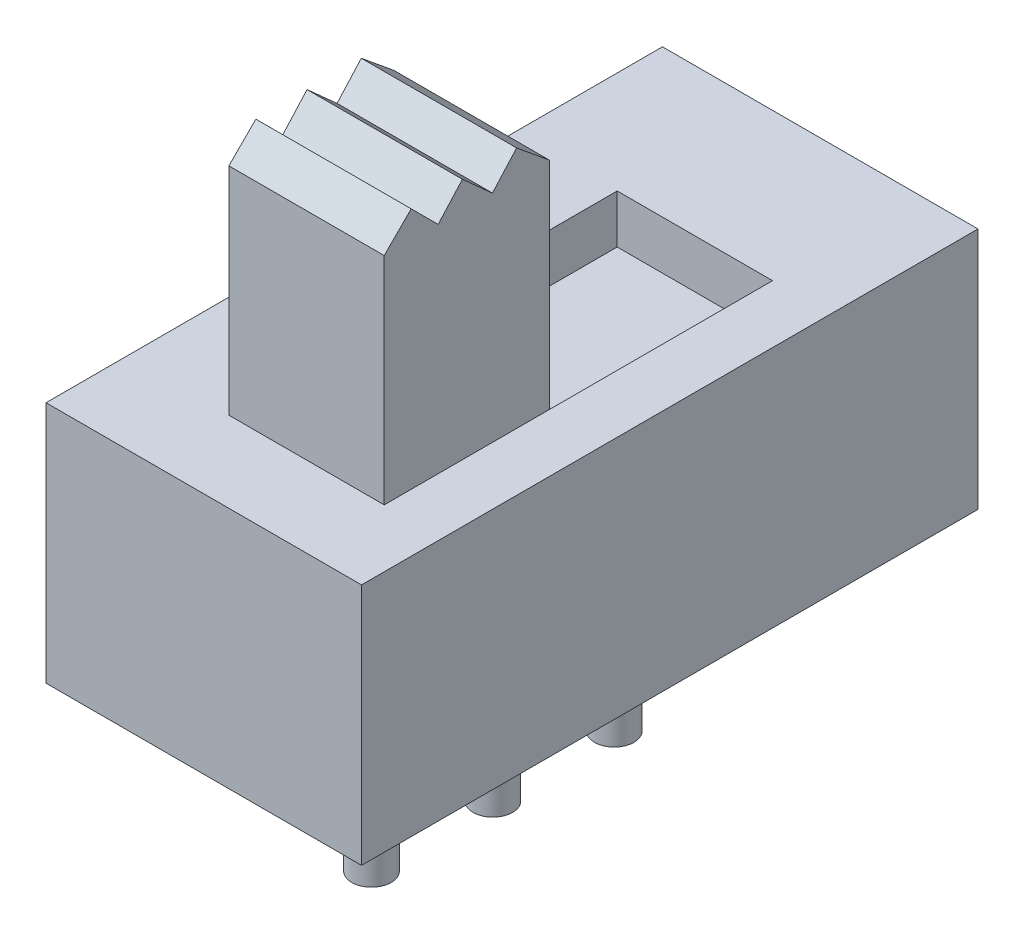
ISO-10303-21;
HEADER;
FILE_DESCRIPTION(('STEP AP214'),'2;1');
FILE_NAME('part.step','',(''),(''),'','','');
FILE_SCHEMA(('AUTOMOTIVE_DESIGN { 1 0 10303 214 1 1 1 1 }'));
ENDSEC;
DATA;
#1=APPLICATION_CONTEXT('core data for automotive mechanical design processes');
#2=APPLICATION_PROTOCOL_DEFINITION('international standard','automotive_design',2000,#1);
#3=PRODUCT_CONTEXT('',#1,'mechanical');
#4=PRODUCT('Part','Part','',(#3));
#5=PRODUCT_RELATED_PRODUCT_CATEGORY('part','',(#4));
#6=PRODUCT_DEFINITION_FORMATION('','',#4);
#7=PRODUCT_DEFINITION_CONTEXT('part definition',#1,'design');
#8=PRODUCT_DEFINITION('design','',#6,#7);
#9=PRODUCT_DEFINITION_SHAPE('','',#8);
#10=(LENGTH_UNIT() NAMED_UNIT(*) SI_UNIT(.MILLI.,.METRE.));
#11=(NAMED_UNIT(*) PLANE_ANGLE_UNIT() SI_UNIT($,.RADIAN.));
#12=(NAMED_UNIT(*) SI_UNIT($,.STERADIAN.) SOLID_ANGLE_UNIT());
#13=UNCERTAINTY_MEASURE_WITH_UNIT(LENGTH_MEASURE(1.E-05),#10,'distance_accuracy_value','');
#14=(GEOMETRIC_REPRESENTATION_CONTEXT(3) GLOBAL_UNCERTAINTY_ASSIGNED_CONTEXT((#13)) GLOBAL_UNIT_ASSIGNED_CONTEXT((#10,
#11,#12)) REPRESENTATION_CONTEXT('',''));
#15=CARTESIAN_POINT('',(0.,0.,0.));
#16=DIRECTION('',(0.,0.,1.));
#17=DIRECTION('',(1.,0.,0.));
#18=AXIS2_PLACEMENT_3D('',#15,#16,#17);
#19=CARTESIAN_POINT('',(0.,5.0038,0.));
#20=DIRECTION('',(0.,1.,0.));
#21=DIRECTION('',(0.,0.,1.));
#22=AXIS2_PLACEMENT_3D('',#19,#20,#21);
#23=PLANE('',#22);
#24=DIRECTION('',(0.,0.,1.));
#25=VECTOR('',#24,1.);
#26=CARTESIAN_POINT('',(-4.3942,5.0038,-5.06502134867186));
#27=LINE('',#26,#25);
#28=CARTESIAN_POINT('',(-4.3942,5.0038,-9.66142134867187));
#29=VERTEX_POINT('',#28);
#30=CARTESIAN_POINT('',(-4.3942,5.0038,-5.06502134867186));
#31=VERTEX_POINT('',#30);
#32=EDGE_CURVE('E220',#29,#31,#27,.T.);
#33=ORIENTED_EDGE('',*,*,#32,.F.);
#34=DIRECTION('',(-1.,0.,0.));
#35=VECTOR('',#34,1.);
#36=CARTESIAN_POINT('',(-4.3942,5.0038,-9.66142134867187));
#37=LINE('',#36,#35);
#38=CARTESIAN_POINT('',(-1.1938,5.0038,-9.66142134867187));
#39=VERTEX_POINT('',#38);
#40=EDGE_CURVE('E225',#39,#29,#37,.T.);
#41=ORIENTED_EDGE('',*,*,#40,.F.);
#42=DIRECTION('',(0.,0.,-1.));
#43=VECTOR('',#42,1.);
#44=CARTESIAN_POINT('',(-1.1938,5.0038,-5.06502134867186));
#45=LINE('',#44,#43);
#46=CARTESIAN_POINT('',(-1.1938,5.0038,-5.06502134867186));
#47=VERTEX_POINT('',#46);
#48=EDGE_CURVE('E237',#47,#39,#45,.T.);
#49=ORIENTED_EDGE('',*,*,#48,.F.);
#50=DIRECTION('',(0.,0.,-1.));
#51=VECTOR('',#50,1.);
#52=CARTESIAN_POINT('',(-1.1938,5.0038,-5.06502134867187));
#53=LINE('',#52,#51);
#54=CARTESIAN_POINT('',(-1.1938,5.0038,-1.66142134867187));
#55=VERTEX_POINT('',#54);
#56=EDGE_CURVE('E257',#55,#47,#53,.T.);
#57=ORIENTED_EDGE('',*,*,#56,.F.);
#58=DIRECTION('',(1.,0.,0.));
#59=VECTOR('',#58,1.);
#60=CARTESIAN_POINT('',(-4.3942,5.0038,-1.66142134867186));
#61=LINE('',#60,#59);
#62=CARTESIAN_POINT('',(-4.3942,5.0038,-1.66142134867186));
#63=VERTEX_POINT('',#62);
#64=EDGE_CURVE('E254',#63,#55,#61,.T.);
#65=ORIENTED_EDGE('',*,*,#64,.F.);
#66=DIRECTION('',(0.,0.,1.));
#67=VECTOR('',#66,1.);
#68=CARTESIAN_POINT('',(-4.3942,5.0038,-5.06502134867186));
#69=LINE('',#68,#67);
#70=EDGE_CURVE('E244',#31,#63,#69,.T.);
#71=ORIENTED_EDGE('',*,*,#70,.F.);
#72=EDGE_LOOP('',(#33,#41,#49,#57,#65,#71));
#73=FACE_BOUND('',#72,.T.);
#74=DIRECTION('',(0.,0.,-1.));
#75=VECTOR('',#74,1.);
#76=CARTESIAN_POINT('',(0.,5.0038,0.));
#77=LINE('',#76,#75);
#78=CARTESIAN_POINT('',(0.,5.0038,0.));
#79=VERTEX_POINT('',#78);
#80=CARTESIAN_POINT('',(0.,5.0038,-12.7));
#81=VERTEX_POINT('',#80);
#82=EDGE_CURVE('E267',#79,#81,#77,.T.);
#83=ORIENTED_EDGE('',*,*,#82,.T.);
#84=DIRECTION('',(-1.,0.,0.));
#85=VECTOR('',#84,1.);
#86=CARTESIAN_POINT('',(0.,5.0038,-12.7));
#87=LINE('',#86,#85);
#88=CARTESIAN_POINT('',(-6.5,5.0038,-12.7));
#89=VERTEX_POINT('',#88);
#90=EDGE_CURVE('E85',#81,#89,#87,.T.);
#91=ORIENTED_EDGE('',*,*,#90,.T.);
#92=DIRECTION('',(0.,0.,1.));
#93=VECTOR('',#92,1.);
#94=CARTESIAN_POINT('',(-6.5,5.0038,0.));
#95=LINE('',#94,#93);
#96=CARTESIAN_POINT('',(-6.5,5.0038,0.));
#97=VERTEX_POINT('',#96);
#98=EDGE_CURVE('E270',#89,#97,#95,.T.);
#99=ORIENTED_EDGE('',*,*,#98,.T.);
#100=DIRECTION('',(1.,0.,0.));
#101=VECTOR('',#100,1.);
#102=CARTESIAN_POINT('',(0.,5.0038,0.));
#103=LINE('',#102,#101);
#104=EDGE_CURVE('E53',#97,#79,#103,.T.);
#105=ORIENTED_EDGE('',*,*,#104,.T.);
#106=EDGE_LOOP('',(#83,#91,#99,#105));
#107=FACE_BOUND('',#106,.T.);
#108=ADVANCED_FACE('F36',(#73,#107),#23,.T.);
#109=CARTESIAN_POINT('',(0.,5.0038,0.));
#110=DIRECTION('',(-1.,0.,0.));
#111=DIRECTION('',(0.,0.,1.));
#112=AXIS2_PLACEMENT_3D('',#109,#110,#111);
#113=PLANE('',#112);
#114=DIRECTION('',(0.,0.,-1.));
#115=VECTOR('',#114,1.);
#116=CARTESIAN_POINT('',(0.,0.,0.));
#117=LINE('',#116,#115);
#118=CARTESIAN_POINT('',(0.,0.,0.));
#119=VERTEX_POINT('',#118);
#120=CARTESIAN_POINT('',(0.,0.,-12.7));
#121=VERTEX_POINT('',#120);
#122=EDGE_CURVE('E266',#119,#121,#117,.T.);
#123=ORIENTED_EDGE('',*,*,#122,.T.);
#124=DIRECTION('',(0.,-1.,0.));
#125=VECTOR('',#124,1.);
#126=CARTESIAN_POINT('',(0.,5.0038,-12.7));
#127=LINE('',#126,#125);
#128=EDGE_CURVE('E285',#81,#121,#127,.T.);
#129=ORIENTED_EDGE('',*,*,#128,.F.);
#130=ORIENTED_EDGE('',*,*,#82,.F.);
#131=DIRECTION('',(0.,-1.,0.));
#132=VECTOR('',#131,1.);
#133=CARTESIAN_POINT('',(0.,5.0038,0.));
#134=LINE('',#133,#132);
#135=EDGE_CURVE('E273',#79,#119,#134,.T.);
#136=ORIENTED_EDGE('',*,*,#135,.T.);
#137=EDGE_LOOP('',(#123,#129,#130,#136));
#138=FACE_BOUND('',#137,.T.);
#139=ADVANCED_FACE('F38',(#138),#113,.F.);
#140=CARTESIAN_POINT('',(0.,5.0038,-12.7));
#141=DIRECTION('',(0.,0.,1.));
#142=DIRECTION('',(1.,0.,0.));
#143=AXIS2_PLACEMENT_3D('',#140,#141,#142);
#144=PLANE('',#143);
#145=DIRECTION('',(-1.,0.,0.));
#146=VECTOR('',#145,1.);
#147=CARTESIAN_POINT('',(0.,0.,-12.7));
#148=LINE('',#147,#146);
#149=CARTESIAN_POINT('',(-6.5,0.,-12.7));
#150=VERTEX_POINT('',#149);
#151=EDGE_CURVE('E276',#121,#150,#148,.T.);
#152=ORIENTED_EDGE('',*,*,#151,.T.);
#153=DIRECTION('',(0.,-1.,0.));
#154=VECTOR('',#153,1.);
#155=CARTESIAN_POINT('',(-6.5,5.0038,-12.7));
#156=LINE('',#155,#154);
#157=EDGE_CURVE('E283',#89,#150,#156,.T.);
#158=ORIENTED_EDGE('',*,*,#157,.F.);
#159=ORIENTED_EDGE('',*,*,#90,.F.);
#160=ORIENTED_EDGE('',*,*,#128,.T.);
#161=EDGE_LOOP('',(#152,#158,#159,#160));
#162=FACE_BOUND('',#161,.T.);
#163=ADVANCED_FACE('F312',(#162),#144,.F.);
#164=CARTESIAN_POINT('',(-6.5,5.0038,0.));
#165=DIRECTION('',(1.,0.,0.));
#166=DIRECTION('',(0.,0.,-1.));
#167=AXIS2_PLACEMENT_3D('',#164,#165,#166);
#168=PLANE('',#167);
#169=DIRECTION('',(0.,0.,1.));
#170=VECTOR('',#169,1.);
#171=CARTESIAN_POINT('',(-6.5,0.,0.));
#172=LINE('',#171,#170);
#173=CARTESIAN_POINT('',(-6.5,0.,0.));
#174=VERTEX_POINT('',#173);
#175=EDGE_CURVE('E71',#150,#174,#172,.T.);
#176=ORIENTED_EDGE('',*,*,#175,.T.);
#177=DIRECTION('',(0.,-1.,0.));
#178=VECTOR('',#177,1.);
#179=CARTESIAN_POINT('',(-6.5,5.0038,0.));
#180=LINE('',#179,#178);
#181=EDGE_CURVE('E281',#97,#174,#180,.T.);
#182=ORIENTED_EDGE('',*,*,#181,.F.);
#183=ORIENTED_EDGE('',*,*,#98,.F.);
#184=ORIENTED_EDGE('',*,*,#157,.T.);
#185=EDGE_LOOP('',(#176,#182,#183,#184));
#186=FACE_BOUND('',#185,.T.);
#187=ADVANCED_FACE('F311',(#186),#168,.F.);
#188=CARTESIAN_POINT('',(0.,5.0038,0.));
#189=DIRECTION('',(0.,0.,-1.));
#190=DIRECTION('',(-1.,0.,0.));
#191=AXIS2_PLACEMENT_3D('',#188,#189,#190);
#192=PLANE('',#191);
#193=DIRECTION('',(1.,0.,0.));
#194=VECTOR('',#193,1.);
#195=CARTESIAN_POINT('',(0.,0.,0.));
#196=LINE('',#195,#194);
#197=EDGE_CURVE('E77',#174,#119,#196,.T.);
#198=ORIENTED_EDGE('',*,*,#197,.T.);
#199=ORIENTED_EDGE('',*,*,#135,.F.);
#200=ORIENTED_EDGE('',*,*,#104,.F.);
#201=ORIENTED_EDGE('',*,*,#181,.T.);
#202=EDGE_LOOP('',(#198,#199,#200,#201));
#203=FACE_BOUND('',#202,.T.);
#204=ADVANCED_FACE('F301',(#203),#192,.F.);
#205=CARTESIAN_POINT('',(0.,0.,0.));
#206=DIRECTION('',(0.,1.,0.));
#207=DIRECTION('',(0.,0.,1.));
#208=AXIS2_PLACEMENT_3D('',#205,#206,#207);
#209=PLANE('',#208);
#210=CARTESIAN_POINT('',(-2.79399999999998,0.,-8.));
#211=DIRECTION('',(0.,1.,0.));
#212=DIRECTION('',(0.,0.,1.));
#213=AXIS2_PLACEMENT_3D('',#210,#211,#212);
#214=CIRCLE('',#213,0.4064);
#215=CARTESIAN_POINT('',(-2.79399999999998,0.,-7.5936));
#216=VERTEX_POINT('',#215);
#217=EDGE_CURVE('E12',#216,#216,#214,.F.);
#218=ORIENTED_EDGE('',*,*,#217,.F.);
#219=EDGE_LOOP('',(#218));
#220=FACE_BOUND('',#219,.T.);
#221=CARTESIAN_POINT('',(-2.79399999999999,0.,-5.5));
#222=DIRECTION('',(0.,1.,0.));
#223=DIRECTION('',(0.,0.,1.));
#224=AXIS2_PLACEMENT_3D('',#221,#222,#223);
#225=CIRCLE('',#224,0.4064);
#226=CARTESIAN_POINT('',(-2.79399999999999,0.,-5.0936));
#227=VERTEX_POINT('',#226);
#228=EDGE_CURVE('E45',#227,#227,#225,.F.);
#229=ORIENTED_EDGE('',*,*,#228,.F.);
#230=EDGE_LOOP('',(#229));
#231=FACE_BOUND('',#230,.T.);
#232=CARTESIAN_POINT('',(-2.794,0.,-3.));
#233=DIRECTION('',(0.,1.,0.));
#234=DIRECTION('',(0.,0.,1.));
#235=AXIS2_PLACEMENT_3D('',#232,#233,#234);
#236=CIRCLE('',#235,0.4064);
#237=CARTESIAN_POINT('',(-2.794,0.,-2.5936));
#238=VERTEX_POINT('',#237);
#239=EDGE_CURVE('E290',#238,#238,#236,.F.);
#240=ORIENTED_EDGE('',*,*,#239,.F.);
#241=EDGE_LOOP('',(#240));
#242=FACE_BOUND('',#241,.T.);
#243=ORIENTED_EDGE('',*,*,#122,.F.);
#244=ORIENTED_EDGE('',*,*,#197,.F.);
#245=ORIENTED_EDGE('',*,*,#175,.F.);
#246=ORIENTED_EDGE('',*,*,#151,.F.);
#247=EDGE_LOOP('',(#243,#244,#245,#246));
#248=FACE_BOUND('',#247,.T.);
#249=ADVANCED_FACE('F297',(#220,#231,#242,#248),#209,.F.);
#250=CARTESIAN_POINT('',(-4.3942,10.0076,-5.06502134867186));
#251=DIRECTION('',(1.,0.,0.));
#252=DIRECTION('',(0.,0.,-1.));
#253=AXIS2_PLACEMENT_3D('',#250,#251,#252);
#254=PLANE('',#253);
#255=DIRECTION('',(0.,0.744044199060188,-0.668130398833105));
#256=VECTOR('',#255,1.);
#257=CARTESIAN_POINT('',(-4.3942,10.3433153841613,-4.69116156837042));
#258=LINE('',#257,#256);
#259=CARTESIAN_POINT('',(-4.3942,9.45189334025085,-3.89069008229637));
#260=VERTEX_POINT('',#259);
#261=CARTESIAN_POINT('',(-4.3942,10.0076,-4.38969876038483));
#262=VERTEX_POINT('',#261);
#263=EDGE_CURVE('E194',#260,#262,#258,.T.);
#264=ORIENTED_EDGE('',*,*,#263,.T.);
#265=DIRECTION('',(0.,-0.63540649360055,-0.772177821418262));
#266=VECTOR('',#265,1.);
#267=CARTESIAN_POINT('',(-4.3942,9.67625513177676,-4.79236565324725));
#268=LINE('',#267,#266);
#269=CARTESIAN_POINT('',(-4.3942,9.45189334025085,-5.06502134867187));
#270=VERTEX_POINT('',#269);
#271=EDGE_CURVE('E165',#262,#270,#268,.T.);
#272=ORIENTED_EDGE('',*,*,#271,.T.);
#273=DIRECTION('',(0.,-1.,0.));
#274=VECTOR('',#273,1.);
#275=CARTESIAN_POINT('',(-4.3942,10.0076,-5.06502134867186));
#276=LINE('',#275,#274);
#277=EDGE_CURVE('E259',#270,#31,#276,.T.);
#278=ORIENTED_EDGE('',*,*,#277,.T.);
#279=ORIENTED_EDGE('',*,*,#70,.T.);
#280=DIRECTION('',(0.,-1.,0.));
#281=VECTOR('',#280,1.);
#282=CARTESIAN_POINT('',(-4.3942,10.0076,-1.66142134867186));
#283=LINE('',#282,#281);
#284=CARTESIAN_POINT('',(-4.3942,9.45189334025085,-1.66142134867186));
#285=VERTEX_POINT('',#284);
#286=EDGE_CURVE('E264',#285,#63,#283,.T.);
#287=ORIENTED_EDGE('',*,*,#286,.F.);
#288=DIRECTION('',(0.,0.707106781186549,-0.707106781186546));
#289=VECTOR('',#288,1.);
#290=CARTESIAN_POINT('',(-4.3942,11.4315466701254,-3.64107467854643));
#291=LINE('',#290,#289);
#292=CARTESIAN_POINT('',(-4.3942,10.0076,-2.21712800842101));
#293=VERTEX_POINT('',#292);
#294=EDGE_CURVE('E217',#285,#293,#291,.T.);
#295=ORIENTED_EDGE('',*,*,#294,.T.);
#296=DIRECTION('',(0.,-0.707106781186547,-0.707106781186548));
#297=VECTOR('',#296,1.);
#298=CARTESIAN_POINT('',(-4.3942,8.58365332987457,-3.64107467854644));
#299=LINE('',#298,#297);
#300=CARTESIAN_POINT('',(-4.3942,9.45189334025085,-2.77283466817016));
#301=VERTEX_POINT('',#300);
#302=EDGE_CURVE('E204',#293,#301,#299,.T.);
#303=ORIENTED_EDGE('',*,*,#302,.T.);
#304=DIRECTION('',(0.,0.744044199060188,-0.668130398833105));
#305=VECTOR('',#304,1.);
#306=CARTESIAN_POINT('',(-4.3942,10.8990220439104,-4.07231483233267));
#307=LINE('',#306,#305);
#308=CARTESIAN_POINT('',(-4.3942,10.0076,-3.27184334625862));
#309=VERTEX_POINT('',#308);
#310=EDGE_CURVE('E209',#301,#309,#307,.T.);
#311=ORIENTED_EDGE('',*,*,#310,.T.);
#312=DIRECTION('',(0.,-0.668130398833104,-0.744044199060188));
#313=VECTOR('',#312,1.);
#314=CARTESIAN_POINT('',(-4.3942,9.11617795608958,-4.26454986259781));
#315=LINE('',#314,#313);
#316=EDGE_CURVE('E169',#309,#260,#315,.T.);
#317=ORIENTED_EDGE('',*,*,#316,.T.);
#318=EDGE_LOOP('',(#264,#272,#278,#279,#287,#295,#303,#311,#317));
#319=FACE_BOUND('',#318,.T.);
#320=ADVANCED_FACE('F300',(#319),#254,.F.);
#321=CARTESIAN_POINT('',(-4.3942,10.0076,-1.66142134867186));
#322=DIRECTION('',(0.,0.,-1.));
#323=DIRECTION('',(-1.,0.,0.));
#324=AXIS2_PLACEMENT_3D('',#321,#322,#323);
#325=PLANE('',#324);
#326=DIRECTION('',(0.,-1.,0.));
#327=VECTOR('',#326,1.);
#328=CARTESIAN_POINT('',(-1.1938,10.0076,-1.66142134867187));
#329=LINE('',#328,#327);
#330=CARTESIAN_POINT('',(-1.1938,9.45189334025085,-1.66142134867187));
#331=VERTEX_POINT('',#330);
#332=EDGE_CURVE('E262',#331,#55,#329,.T.);
#333=ORIENTED_EDGE('',*,*,#332,.F.);
#334=DIRECTION('',(1.,0.,0.));
#335=VECTOR('',#334,1.);
#336=CARTESIAN_POINT('',(-12.1938,9.45189334025085,-1.66142134867186));
#337=LINE('',#336,#335);
#338=EDGE_CURVE('E215',#285,#331,#337,.T.);
#339=ORIENTED_EDGE('',*,*,#338,.F.);
#340=ORIENTED_EDGE('',*,*,#286,.T.);
#341=ORIENTED_EDGE('',*,*,#64,.T.);
#342=EDGE_LOOP('',(#333,#339,#340,#341));
#343=FACE_BOUND('',#342,.T.);
#344=ADVANCED_FACE('F345',(#343),#325,.F.);
#345=CARTESIAN_POINT('',(-1.1938,10.0076,-5.06502134867187));
#346=DIRECTION('',(-1.,0.,0.));
#347=DIRECTION('',(0.,0.,1.));
#348=AXIS2_PLACEMENT_3D('',#345,#346,#347);
#349=PLANE('',#348);
#350=DIRECTION('',(0.,-1.,0.));
#351=VECTOR('',#350,1.);
#352=CARTESIAN_POINT('',(-1.1938,10.0076,-5.06502134867187));
#353=LINE('',#352,#351);
#354=CARTESIAN_POINT('',(-1.1938,9.45189334025085,-5.06502134867187));
#355=VERTEX_POINT('',#354);
#356=EDGE_CURVE('E179',#355,#47,#353,.T.);
#357=ORIENTED_EDGE('',*,*,#356,.F.);
#358=DIRECTION('',(0.,-0.63540649360055,-0.772177821418262));
#359=VECTOR('',#358,1.);
#360=CARTESIAN_POINT('',(-1.1938,8.12090910244862,-6.68250011138384));
#361=LINE('',#360,#359);
#362=CARTESIAN_POINT('',(-1.1938,10.0076,-4.38969876038483));
#363=VERTEX_POINT('',#362);
#364=EDGE_CURVE('E162',#363,#355,#361,.T.);
#365=ORIENTED_EDGE('',*,*,#364,.F.);
#366=DIRECTION('',(0.,0.744044199060188,-0.668130398833105));
#367=VECTOR('',#366,1.);
#368=CARTESIAN_POINT('',(-1.1938,2.28517425341308,2.5448185714394));
#369=LINE('',#368,#367);
#370=CARTESIAN_POINT('',(-1.1938,9.45189334025085,-3.89069008229637));
#371=VERTEX_POINT('',#370);
#372=EDGE_CURVE('E177',#371,#363,#369,.T.);
#373=ORIENTED_EDGE('',*,*,#372,.F.);
#374=DIRECTION('',(0.,-0.668130398833104,-0.744044199060188));
#375=VECTOR('',#374,1.);
#376=CARTESIAN_POINT('',(-1.1938,7.16671908683777,-6.43550865373577));
#377=LINE('',#376,#375);
#378=CARTESIAN_POINT('',(-1.1938,10.0076,-3.27184334625862));
#379=VERTEX_POINT('',#378);
#380=EDGE_CURVE('E186',#379,#371,#377,.T.);
#381=ORIENTED_EDGE('',*,*,#380,.F.);
#382=DIRECTION('',(0.,0.744044199060188,-0.668130398833105));
#383=VECTOR('',#382,1.);
#384=CARTESIAN_POINT('',(-1.1938,2.84088091316223,3.16366530747715));
#385=LINE('',#384,#383);
#386=CARTESIAN_POINT('',(-1.1938,9.45189334025085,-2.77283466817016));
#387=VERTEX_POINT('',#386);
#388=EDGE_CURVE('E201',#387,#379,#385,.T.);
#389=ORIENTED_EDGE('',*,*,#388,.F.);
#390=DIRECTION('',(0.,-0.707106781186547,-0.707106781186548));
#391=VECTOR('',#390,1.);
#392=CARTESIAN_POINT('',(-1.1938,6.11236400421051,-6.1123640042105));
#393=LINE('',#392,#391);
#394=CARTESIAN_POINT('',(-1.1938,10.0076,-2.21712800842101));
#395=VERTEX_POINT('',#394);
#396=EDGE_CURVE('E200',#395,#387,#393,.T.);
#397=ORIENTED_EDGE('',*,*,#396,.F.);
#398=DIRECTION('',(0.,0.707106781186549,-0.707106781186546));
#399=VECTOR('',#398,1.);
#400=CARTESIAN_POINT('',(-1.1938,3.89523599578948,3.89523599578949));
#401=LINE('',#400,#399);
#402=EDGE_CURVE('E212',#331,#395,#401,.T.);
#403=ORIENTED_EDGE('',*,*,#402,.F.);
#404=ORIENTED_EDGE('',*,*,#332,.T.);
#405=ORIENTED_EDGE('',*,*,#56,.T.);
#406=EDGE_LOOP('',(#357,#365,#373,#381,#389,#397,#403,#404,#405));
#407=FACE_BOUND('',#406,.T.);
#408=ADVANCED_FACE('F175',(#407),#349,.F.);
#409=CARTESIAN_POINT('',(-4.3942,10.0076,-5.06502134867186));
#410=DIRECTION('',(0.,0.,1.));
#411=DIRECTION('',(1.,0.,0.));
#412=AXIS2_PLACEMENT_3D('',#409,#410,#411);
#413=PLANE('',#412);
#414=ORIENTED_EDGE('',*,*,#277,.F.);
#415=DIRECTION('',(1.,0.,0.));
#416=VECTOR('',#415,1.);
#417=CARTESIAN_POINT('',(-12.1938,9.45189334025085,-5.06502134867186));
#418=LINE('',#417,#416);
#419=EDGE_CURVE('E180',#270,#355,#418,.T.);
#420=ORIENTED_EDGE('',*,*,#419,.T.);
#421=ORIENTED_EDGE('',*,*,#356,.T.);
#422=DIRECTION('',(0.,1.,0.));
#423=VECTOR('',#422,1.);
#424=CARTESIAN_POINT('',(-1.1938,4.0038,-5.06502134867186));
#425=LINE('',#424,#423);
#426=CARTESIAN_POINT('',(-1.1938,4.0038,-5.06502134867186));
#427=VERTEX_POINT('',#426);
#428=EDGE_CURVE('E247',#427,#47,#425,.T.);
#429=ORIENTED_EDGE('',*,*,#428,.F.);
#430=DIRECTION('',(1.,0.,0.));
#431=VECTOR('',#430,1.);
#432=CARTESIAN_POINT('',(-4.3942,4.0038,-5.06502134867186));
#433=LINE('',#432,#431);
#434=CARTESIAN_POINT('',(-4.3942,4.0038,-5.06502134867186));
#435=VERTEX_POINT('',#434);
#436=EDGE_CURVE('E224',#435,#427,#433,.T.);
#437=ORIENTED_EDGE('',*,*,#436,.F.);
#438=DIRECTION('',(0.,1.,0.));
#439=VECTOR('',#438,1.);
#440=CARTESIAN_POINT('',(-4.3942,4.0038,-5.06502134867186));
#441=LINE('',#440,#439);
#442=EDGE_CURVE('E234',#435,#31,#441,.T.);
#443=ORIENTED_EDGE('',*,*,#442,.T.);
#444=EDGE_LOOP('',(#414,#420,#421,#429,#437,#443));
#445=FACE_BOUND('',#444,.T.);
#446=ADVANCED_FACE('F359',(#445),#413,.F.);
#447=CARTESIAN_POINT('',(-4.3942,4.0038,-5.06502134867186));
#448=DIRECTION('',(-1.,0.,0.));
#449=DIRECTION('',(0.,0.,1.));
#450=AXIS2_PLACEMENT_3D('',#447,#448,#449);
#451=PLANE('',#450);
#452=ORIENTED_EDGE('',*,*,#32,.T.);
#453=ORIENTED_EDGE('',*,*,#442,.F.);
#454=DIRECTION('',(0.,0.,1.));
#455=VECTOR('',#454,1.);
#456=CARTESIAN_POINT('',(-4.3942,4.0038,-5.06502134867186));
#457=LINE('',#456,#455);
#458=CARTESIAN_POINT('',(-4.3942,4.0038,-9.66142134867187));
#459=VERTEX_POINT('',#458);
#460=EDGE_CURVE('E221',#459,#435,#457,.T.);
#461=ORIENTED_EDGE('',*,*,#460,.F.);
#462=DIRECTION('',(0.,1.,0.));
#463=VECTOR('',#462,1.);
#464=CARTESIAN_POINT('',(-4.3942,4.0038,-9.66142134867187));
#465=LINE('',#464,#463);
#466=EDGE_CURVE('E242',#459,#29,#465,.T.);
#467=ORIENTED_EDGE('',*,*,#466,.T.);
#468=EDGE_LOOP('',(#452,#453,#461,#467));
#469=FACE_BOUND('',#468,.T.);
#470=ADVANCED_FACE('F366',(#469),#451,.F.);
#471=CARTESIAN_POINT('',(-4.3942,4.0038,-9.66142134867187));
#472=DIRECTION('',(0.,0.,-1.));
#473=DIRECTION('',(-1.,0.,0.));
#474=AXIS2_PLACEMENT_3D('',#471,#472,#473);
#475=PLANE('',#474);
#476=ORIENTED_EDGE('',*,*,#40,.T.);
#477=ORIENTED_EDGE('',*,*,#466,.F.);
#478=DIRECTION('',(-1.,0.,0.));
#479=VECTOR('',#478,1.);
#480=CARTESIAN_POINT('',(-4.3942,4.0038,-9.66142134867187));
#481=LINE('',#480,#479);
#482=CARTESIAN_POINT('',(-1.1938,4.0038,-9.66142134867187));
#483=VERTEX_POINT('',#482);
#484=EDGE_CURVE('E231',#483,#459,#481,.T.);
#485=ORIENTED_EDGE('',*,*,#484,.F.);
#486=DIRECTION('',(0.,1.,0.));
#487=VECTOR('',#486,1.);
#488=CARTESIAN_POINT('',(-1.1938,4.0038,-9.66142134867187));
#489=LINE('',#488,#487);
#490=EDGE_CURVE('E245',#483,#39,#489,.T.);
#491=ORIENTED_EDGE('',*,*,#490,.T.);
#492=EDGE_LOOP('',(#476,#477,#485,#491));
#493=FACE_BOUND('',#492,.T.);
#494=ADVANCED_FACE('F375',(#493),#475,.F.);
#495=CARTESIAN_POINT('',(-1.1938,4.0038,-5.06502134867186));
#496=DIRECTION('',(1.,0.,0.));
#497=DIRECTION('',(0.,0.,-1.));
#498=AXIS2_PLACEMENT_3D('',#495,#496,#497);
#499=PLANE('',#498);
#500=ORIENTED_EDGE('',*,*,#48,.T.);
#501=ORIENTED_EDGE('',*,*,#490,.F.);
#502=DIRECTION('',(0.,0.,-1.));
#503=VECTOR('',#502,1.);
#504=CARTESIAN_POINT('',(-1.1938,4.0038,-5.06502134867186));
#505=LINE('',#504,#503);
#506=EDGE_CURVE('E228',#427,#483,#505,.T.);
#507=ORIENTED_EDGE('',*,*,#506,.F.);
#508=ORIENTED_EDGE('',*,*,#428,.T.);
#509=EDGE_LOOP('',(#500,#501,#507,#508));
#510=FACE_BOUND('',#509,.T.);
#511=ADVANCED_FACE('F383',(#510),#499,.F.);
#512=CARTESIAN_POINT('',(0.,4.0038,0.));
#513=DIRECTION('',(0.,-1.,0.));
#514=DIRECTION('',(0.,0.,-1.));
#515=AXIS2_PLACEMENT_3D('',#512,#513,#514);
#516=PLANE('',#515);
#517=ORIENTED_EDGE('',*,*,#460,.T.);
#518=ORIENTED_EDGE('',*,*,#436,.T.);
#519=ORIENTED_EDGE('',*,*,#506,.T.);
#520=ORIENTED_EDGE('',*,*,#484,.T.);
#521=EDGE_LOOP('',(#517,#518,#519,#520));
#522=FACE_BOUND('',#521,.T.);
#523=ADVANCED_FACE('F391',(#522),#516,.F.);
#524=CARTESIAN_POINT('',(-12.1938,3.89523599578948,3.89523599578949));
#525=DIRECTION('',(0.,-0.707106781186546,-0.707106781186549));
#526=DIRECTION('',(0.,0.707106781186549,-0.707106781186546));
#527=AXIS2_PLACEMENT_3D('',#524,#525,#526);
#528=PLANE('',#527);
#529=ORIENTED_EDGE('',*,*,#338,.T.);
#530=ORIENTED_EDGE('',*,*,#402,.T.);
#531=DIRECTION('',(-1.,0.,0.));
#532=VECTOR('',#531,1.);
#533=CARTESIAN_POINT('',(0.,10.0076,-2.21712800842101));
#534=LINE('',#533,#532);
#535=EDGE_CURVE('E287',#395,#293,#534,.T.);
#536=ORIENTED_EDGE('',*,*,#535,.T.);
#537=ORIENTED_EDGE('',*,*,#294,.F.);
#538=EDGE_LOOP('',(#529,#530,#536,#537));
#539=FACE_BOUND('',#538,.T.);
#540=ADVANCED_FACE('F398',(#539),#528,.F.);
#541=CARTESIAN_POINT('',(-12.1938,2.84088091316223,3.16366530747716));
#542=DIRECTION('',(0.,-0.668130398833105,-0.744044199060188));
#543=DIRECTION('',(0.,0.744044199060188,-0.668130398833105));
#544=AXIS2_PLACEMENT_3D('',#541,#542,#543);
#545=PLANE('',#544);
#546=DIRECTION('',(1.,0.,0.));
#547=VECTOR('',#546,1.);
#548=CARTESIAN_POINT('',(-12.1938,9.45189334025085,-2.77283466817016));
#549=LINE('',#548,#547);
#550=EDGE_CURVE('E196',#301,#387,#549,.T.);
#551=ORIENTED_EDGE('',*,*,#550,.T.);
#552=ORIENTED_EDGE('',*,*,#388,.T.);
#553=DIRECTION('',(1.,0.,0.));
#554=VECTOR('',#553,1.);
#555=CARTESIAN_POINT('',(-12.1938,10.0076,-3.27184334625861));
#556=LINE('',#555,#554);
#557=EDGE_CURVE('E198',#309,#379,#556,.T.);
#558=ORIENTED_EDGE('',*,*,#557,.F.);
#559=ORIENTED_EDGE('',*,*,#310,.F.);
#560=EDGE_LOOP('',(#551,#552,#558,#559));
#561=FACE_BOUND('',#560,.T.);
#562=ADVANCED_FACE('F405',(#561),#545,.F.);
#563=CARTESIAN_POINT('',(-12.1938,6.11236400421051,-6.1123640042105));
#564=DIRECTION('',(0.,-0.707106781186548,0.707106781186547));
#565=DIRECTION('',(0.,-0.707106781186547,-0.707106781186548));
#566=AXIS2_PLACEMENT_3D('',#563,#564,#565);
#567=PLANE('',#566);
#568=ORIENTED_EDGE('',*,*,#535,.F.);
#569=ORIENTED_EDGE('',*,*,#396,.T.);
#570=ORIENTED_EDGE('',*,*,#550,.F.);
#571=ORIENTED_EDGE('',*,*,#302,.F.);
#572=EDGE_LOOP('',(#568,#569,#570,#571));
#573=FACE_BOUND('',#572,.T.);
#574=ADVANCED_FACE('F413',(#573),#567,.F.);
#575=CARTESIAN_POINT('',(-12.1938,2.28517425341308,2.54481857143941));
#576=DIRECTION('',(0.,-0.668130398833105,-0.744044199060188));
#577=DIRECTION('',(0.,0.744044199060188,-0.668130398833105));
#578=AXIS2_PLACEMENT_3D('',#575,#576,#577);
#579=PLANE('',#578);
#580=DIRECTION('',(1.,0.,0.));
#581=VECTOR('',#580,1.);
#582=CARTESIAN_POINT('',(-12.1938,9.45189334025085,-3.89069008229636));
#583=LINE('',#582,#581);
#584=EDGE_CURVE('E170',#260,#371,#583,.T.);
#585=ORIENTED_EDGE('',*,*,#584,.T.);
#586=ORIENTED_EDGE('',*,*,#372,.T.);
#587=DIRECTION('',(1.,0.,0.));
#588=VECTOR('',#587,1.);
#589=CARTESIAN_POINT('',(-12.1938,10.0076,-4.38969876038482));
#590=LINE('',#589,#588);
#591=EDGE_CURVE('E159',#262,#363,#590,.T.);
#592=ORIENTED_EDGE('',*,*,#591,.F.);
#593=ORIENTED_EDGE('',*,*,#263,.F.);
#594=EDGE_LOOP('',(#585,#586,#592,#593));
#595=FACE_BOUND('',#594,.T.);
#596=ADVANCED_FACE('F183',(#595),#579,.F.);
#597=CARTESIAN_POINT('',(-12.1938,7.16671908683777,-6.43550865373577));
#598=DIRECTION('',(0.,-0.744044199060188,0.668130398833104));
#599=DIRECTION('',(0.,-0.668130398833104,-0.744044199060188));
#600=AXIS2_PLACEMENT_3D('',#597,#598,#599);
#601=PLANE('',#600);
#602=ORIENTED_EDGE('',*,*,#557,.T.);
#603=ORIENTED_EDGE('',*,*,#380,.T.);
#604=ORIENTED_EDGE('',*,*,#584,.F.);
#605=ORIENTED_EDGE('',*,*,#316,.F.);
#606=EDGE_LOOP('',(#602,#603,#604,#605));
#607=FACE_BOUND('',#606,.T.);
#608=ADVANCED_FACE('F428',(#607),#601,.F.);
#609=CARTESIAN_POINT('',(-12.1938,8.12090910244862,-6.68250011138384));
#610=DIRECTION('',(0.,-0.772177821418262,0.63540649360055));
#611=DIRECTION('',(0.,-0.63540649360055,-0.772177821418262));
#612=AXIS2_PLACEMENT_3D('',#609,#610,#611);
#613=PLANE('',#612);
#614=ORIENTED_EDGE('',*,*,#591,.T.);
#615=ORIENTED_EDGE('',*,*,#364,.T.);
#616=ORIENTED_EDGE('',*,*,#419,.F.);
#617=ORIENTED_EDGE('',*,*,#271,.F.);
#618=EDGE_LOOP('',(#614,#615,#616,#617));
#619=FACE_BOUND('',#618,.T.);
#620=ADVANCED_FACE('F161',(#619),#613,.F.);
#621=CARTESIAN_POINT('',(-2.794,-3.,-3.));
#622=DIRECTION('',(0.,1.,0.));
#623=DIRECTION('',(0.,0.,1.));
#624=AXIS2_PLACEMENT_3D('',#621,#622,#623);
#625=CYLINDRICAL_SURFACE('',#624,0.4064);
#626=CARTESIAN_POINT('',(-2.794,-3.,-3.));
#627=DIRECTION('',(0.,-1.,0.));
#628=DIRECTION('',(0.,0.,-1.));
#629=AXIS2_PLACEMENT_3D('',#626,#627,#628);
#630=CIRCLE('',#629,0.4064);
#631=CARTESIAN_POINT('',(-2.794,-3.,-3.4064));
#632=VERTEX_POINT('',#631);
#633=EDGE_CURVE('E181',#632,#632,#630,.T.);
#634=ORIENTED_EDGE('',*,*,#633,.F.);
#635=EDGE_LOOP('',(#634));
#636=FACE_BOUND('',#635,.T.);
#637=ORIENTED_EDGE('',*,*,#239,.T.);
#638=EDGE_LOOP('',(#637));
#639=FACE_BOUND('',#638,.T.);
#640=ADVANCED_FACE('F441',(#636,#639),#625,.T.);
#641=CARTESIAN_POINT('',(-2.794,-3.,-3.));
#642=DIRECTION('',(0.,-1.,0.));
#643=DIRECTION('',(0.,0.,-1.));
#644=AXIS2_PLACEMENT_3D('',#641,#642,#643);
#645=PLANE('',#644);
#646=ORIENTED_EDGE('',*,*,#633,.T.);
#647=EDGE_LOOP('',(#646));
#648=FACE_BOUND('',#647,.T.);
#649=ADVANCED_FACE('F447',(#648),#645,.T.);
#650=CARTESIAN_POINT('',(-2.79399999999999,-3.,-5.5));
#651=DIRECTION('',(0.,1.,0.));
#652=DIRECTION('',(0.,0.,1.));
#653=AXIS2_PLACEMENT_3D('',#650,#651,#652);
#654=CYLINDRICAL_SURFACE('',#653,0.4064);
#655=CARTESIAN_POINT('',(-2.79399999999999,-3.,-5.5));
#656=DIRECTION('',(0.,-1.,0.));
#657=DIRECTION('',(0.,0.,-1.));
#658=AXIS2_PLACEMENT_3D('',#655,#656,#657);
#659=CIRCLE('',#658,0.4064);
#660=CARTESIAN_POINT('',(-2.79399999999999,-3.,-5.9064));
#661=VERTEX_POINT('',#660);
#662=EDGE_CURVE('E557',#661,#661,#659,.T.);
#663=ORIENTED_EDGE('',*,*,#662,.F.);
#664=EDGE_LOOP('',(#663));
#665=FACE_BOUND('',#664,.T.);
#666=ORIENTED_EDGE('',*,*,#228,.T.);
#667=EDGE_LOOP('',(#666));
#668=FACE_BOUND('',#667,.T.);
#669=ADVANCED_FACE('F295',(#665,#668),#654,.T.);
#670=CARTESIAN_POINT('',(-2.79399999999999,-3.,-5.5));
#671=DIRECTION('',(0.,-1.,0.));
#672=DIRECTION('',(0.,0.,-1.));
#673=AXIS2_PLACEMENT_3D('',#670,#671,#672);
#674=PLANE('',#673);
#675=ORIENTED_EDGE('',*,*,#662,.T.);
#676=EDGE_LOOP('',(#675));
#677=FACE_BOUND('',#676,.T.);
#678=ADVANCED_FACE('F462',(#677),#674,.T.);
#679=CARTESIAN_POINT('',(-2.79399999999998,-3.,-8.));
#680=DIRECTION('',(0.,1.,0.));
#681=DIRECTION('',(0.,0.,1.));
#682=AXIS2_PLACEMENT_3D('',#679,#680,#681);
#683=CYLINDRICAL_SURFACE('',#682,0.4064);
#684=CARTESIAN_POINT('',(-2.79399999999998,-3.,-8.));
#685=DIRECTION('',(0.,-1.,0.));
#686=DIRECTION('',(0.,0.,-1.));
#687=AXIS2_PLACEMENT_3D('',#684,#685,#686);
#688=CIRCLE('',#687,0.4064);
#689=CARTESIAN_POINT('',(-2.79399999999998,-3.,-8.4064));
#690=VERTEX_POINT('',#689);
#691=EDGE_CURVE('E556',#690,#690,#688,.T.);
#692=ORIENTED_EDGE('',*,*,#691,.F.);
#693=EDGE_LOOP('',(#692));
#694=FACE_BOUND('',#693,.T.);
#695=ORIENTED_EDGE('',*,*,#217,.T.);
#696=EDGE_LOOP('',(#695));
#697=FACE_BOUND('',#696,.T.);
#698=ADVANCED_FACE('F470',(#694,#697),#683,.T.);
#699=CARTESIAN_POINT('',(-2.79399999999998,-3.,-8.));
#700=DIRECTION('',(0.,-1.,0.));
#701=DIRECTION('',(0.,0.,-1.));
#702=AXIS2_PLACEMENT_3D('',#699,#700,#701);
#703=PLANE('',#702);
#704=ORIENTED_EDGE('',*,*,#691,.T.);
#705=EDGE_LOOP('',(#704));
#706=FACE_BOUND('',#705,.T.);
#707=ADVANCED_FACE('F478',(#706),#703,.T.);
#708=CLOSED_SHELL('',(#108,#139,#163,#187,#204,#249,#320,#344,#408,#446,#470,#494,#511,#523,
#540,#562,#574,#596,#608,#620,#640,#649,#669,#678,#698,#707));
#709=MANIFOLD_SOLID_BREP('B2',#708);
#710=ADVANCED_BREP_SHAPE_REPRESENTATION('',(#18,#709),#14);
#711=SHAPE_DEFINITION_REPRESENTATION(#9,#710);
ENDSEC;
END-ISO-10303-21;
